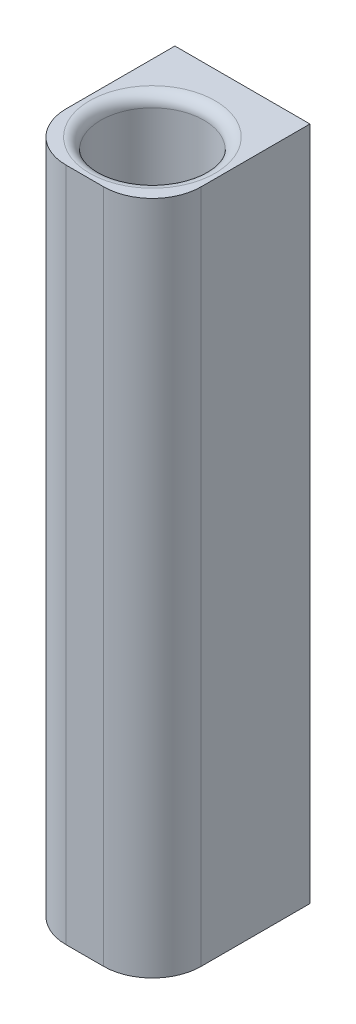
ISO-10303-21;
HEADER;
FILE_DESCRIPTION(('STEP AP214'),'2;1');
FILE_NAME('part.step','',(''),(''),'','','');
FILE_SCHEMA(('AUTOMOTIVE_DESIGN { 1 0 10303 214 1 1 1 1 }'));
ENDSEC;
DATA;
#1=APPLICATION_CONTEXT('core data for automotive mechanical design processes');
#2=APPLICATION_PROTOCOL_DEFINITION('international standard','automotive_design',2000,#1);
#3=PRODUCT_CONTEXT('',#1,'mechanical');
#4=PRODUCT('Part','Part','',(#3));
#5=PRODUCT_RELATED_PRODUCT_CATEGORY('part','',(#4));
#6=PRODUCT_DEFINITION_FORMATION('','',#4);
#7=PRODUCT_DEFINITION_CONTEXT('part definition',#1,'design');
#8=PRODUCT_DEFINITION('design','',#6,#7);
#9=PRODUCT_DEFINITION_SHAPE('','',#8);
#10=(LENGTH_UNIT() NAMED_UNIT(*) SI_UNIT(.MILLI.,.METRE.));
#11=(NAMED_UNIT(*) PLANE_ANGLE_UNIT() SI_UNIT($,.RADIAN.));
#12=(NAMED_UNIT(*) SI_UNIT($,.STERADIAN.) SOLID_ANGLE_UNIT());
#13=UNCERTAINTY_MEASURE_WITH_UNIT(LENGTH_MEASURE(1.E-05),#10,'distance_accuracy_value','');
#14=(GEOMETRIC_REPRESENTATION_CONTEXT(3) GLOBAL_UNCERTAINTY_ASSIGNED_CONTEXT((#13)) GLOBAL_UNIT_ASSIGNED_CONTEXT((#10,
#11,#12)) REPRESENTATION_CONTEXT('',''));
#15=CARTESIAN_POINT('',(0.,0.,0.));
#16=DIRECTION('',(0.,0.,1.));
#17=DIRECTION('',(1.,0.,0.));
#18=AXIS2_PLACEMENT_3D('',#15,#16,#17);
#19=CARTESIAN_POINT('',(0.,180.,0.));
#20=DIRECTION('',(0.,1.,0.));
#21=DIRECTION('',(0.,0.,1.));
#22=AXIS2_PLACEMENT_3D('',#19,#20,#21);
#23=PLANE('',#22);
#24=CARTESIAN_POINT('',(0.,180.,-5.83724052362973));
#25=DIRECTION('',(0.,1.,0.));
#26=DIRECTION('',(0.,0.,1.));
#27=AXIS2_PLACEMENT_3D('',#24,#25,#26);
#28=CIRCLE('',#27,16.75);
#29=CARTESIAN_POINT('',(0.,180.,10.9127594763703));
#30=VERTEX_POINT('',#29);
#31=EDGE_CURVE('E11',#30,#30,#28,.F.);
#32=ORIENTED_EDGE('',*,*,#31,.T.);
#33=EDGE_LOOP('',(#32));
#34=FACE_BOUND('',#33,.T.);
#35=DIRECTION('',(0.,0.,1.));
#36=VECTOR('',#35,1.);
#37=CARTESIAN_POINT('',(-18.,180.,-29.8372405236297));
#38=LINE('',#37,#36);
#39=CARTESIAN_POINT('',(-18.,180.,-29.8372405236297));
#40=VERTEX_POINT('',#39);
#41=CARTESIAN_POINT('',(-18.,180.,-0.837240523629726));
#42=VERTEX_POINT('',#41);
#43=EDGE_CURVE('E92',#40,#42,#38,.T.);
#44=ORIENTED_EDGE('',*,*,#43,.T.);
#45=CARTESIAN_POINT('',(-5.,180.,-0.837240523629726));
#46=DIRECTION('',(0.,1.,0.));
#47=DIRECTION('',(0.,0.,1.));
#48=AXIS2_PLACEMENT_3D('',#45,#46,#47);
#49=CIRCLE('',#48,13.);
#50=CARTESIAN_POINT('',(-5.,180.,12.1627594763703));
#51=VERTEX_POINT('',#50);
#52=EDGE_CURVE('E136',#42,#51,#49,.T.);
#53=ORIENTED_EDGE('',*,*,#52,.T.);
#54=DIRECTION('',(1.,0.,0.));
#55=VECTOR('',#54,1.);
#56=CARTESIAN_POINT('',(-18.,180.,12.1627594763703));
#57=LINE('',#56,#55);
#58=CARTESIAN_POINT('',(5.00000000000001,180.,12.1627594763703));
#59=VERTEX_POINT('',#58);
#60=EDGE_CURVE('E114',#51,#59,#57,.T.);
#61=ORIENTED_EDGE('',*,*,#60,.T.);
#62=CARTESIAN_POINT('',(5.00000000000001,180.,-0.837240523629726));
#63=DIRECTION('',(0.,1.,0.));
#64=DIRECTION('',(0.,0.,1.));
#65=AXIS2_PLACEMENT_3D('',#62,#63,#64);
#66=CIRCLE('',#65,13.);
#67=CARTESIAN_POINT('',(18.,180.,-0.837240523629726));
#68=VERTEX_POINT('',#67);
#69=EDGE_CURVE('E53',#59,#68,#66,.T.);
#70=ORIENTED_EDGE('',*,*,#69,.T.);
#71=DIRECTION('',(0.,0.,-1.));
#72=VECTOR('',#71,1.);
#73=CARTESIAN_POINT('',(18.,180.,12.1627594763703));
#74=LINE('',#73,#72);
#75=CARTESIAN_POINT('',(18.,180.,-29.8372405236297));
#76=VERTEX_POINT('',#75);
#77=EDGE_CURVE('E100',#68,#76,#74,.T.);
#78=ORIENTED_EDGE('',*,*,#77,.T.);
#79=DIRECTION('',(-1.,0.,0.));
#80=VECTOR('',#79,1.);
#81=CARTESIAN_POINT('',(18.,180.,-29.8372405236297));
#82=LINE('',#81,#80);
#83=EDGE_CURVE('E91',#76,#40,#82,.T.);
#84=ORIENTED_EDGE('',*,*,#83,.T.);
#85=EDGE_LOOP('',(#44,#53,#61,#70,#78,#84));
#86=FACE_BOUND('',#85,.T.);
#87=ADVANCED_FACE('F39',(#34,#86),#23,.T.);
#88=CARTESIAN_POINT('',(0.,0.,0.));
#89=DIRECTION('',(0.,1.,0.));
#90=DIRECTION('',(0.,0.,1.));
#91=AXIS2_PLACEMENT_3D('',#88,#89,#90);
#92=PLANE('',#91);
#93=CARTESIAN_POINT('',(0.,0.,-5.83724052362973));
#94=DIRECTION('',(0.,1.,0.));
#95=DIRECTION('',(0.,0.,1.));
#96=AXIS2_PLACEMENT_3D('',#93,#94,#95);
#97=CIRCLE('',#96,16.75);
#98=CARTESIAN_POINT('',(0.,0.,10.9127594763703));
#99=VERTEX_POINT('',#98);
#100=EDGE_CURVE('E143',#99,#99,#97,.T.);
#101=ORIENTED_EDGE('',*,*,#100,.T.);
#102=EDGE_LOOP('',(#101));
#103=FACE_BOUND('',#102,.T.);
#104=DIRECTION('',(1.,0.,0.));
#105=VECTOR('',#104,1.);
#106=CARTESIAN_POINT('',(-18.,0.,12.1627594763703));
#107=LINE('',#106,#105);
#108=CARTESIAN_POINT('',(-5.,0.,12.1627594763703));
#109=VERTEX_POINT('',#108);
#110=CARTESIAN_POINT('',(5.00000000000001,0.,12.1627594763703));
#111=VERTEX_POINT('',#110);
#112=EDGE_CURVE('E121',#109,#111,#107,.T.);
#113=ORIENTED_EDGE('',*,*,#112,.F.);
#114=CARTESIAN_POINT('',(-5.,0.,-0.837240523629726));
#115=DIRECTION('',(0.,1.,0.));
#116=DIRECTION('',(0.,0.,1.));
#117=AXIS2_PLACEMENT_3D('',#114,#115,#116);
#118=CIRCLE('',#117,13.);
#119=CARTESIAN_POINT('',(-18.,0.,-0.837240523629726));
#120=VERTEX_POINT('',#119);
#121=EDGE_CURVE('E134',#109,#120,#118,.F.);
#122=ORIENTED_EDGE('',*,*,#121,.T.);
#123=DIRECTION('',(0.,0.,1.));
#124=VECTOR('',#123,1.);
#125=CARTESIAN_POINT('',(-18.,0.,-29.8372405236297));
#126=LINE('',#125,#124);
#127=CARTESIAN_POINT('',(-18.,0.,-29.8372405236297));
#128=VERTEX_POINT('',#127);
#129=EDGE_CURVE('E120',#128,#120,#126,.T.);
#130=ORIENTED_EDGE('',*,*,#129,.F.);
#131=DIRECTION('',(-1.,0.,0.));
#132=VECTOR('',#131,1.);
#133=CARTESIAN_POINT('',(0.,0.,-29.8372405236297));
#134=LINE('',#133,#132);
#135=CARTESIAN_POINT('',(18.,0.,-29.8372405236297));
#136=VERTEX_POINT('',#135);
#137=EDGE_CURVE('E110',#136,#128,#134,.T.);
#138=ORIENTED_EDGE('',*,*,#137,.F.);
#139=DIRECTION('',(0.,0.,-1.));
#140=VECTOR('',#139,1.);
#141=CARTESIAN_POINT('',(18.,0.,12.1627594763703));
#142=LINE('',#141,#140);
#143=CARTESIAN_POINT('',(18.,0.,-0.837240523629726));
#144=VERTEX_POINT('',#143);
#145=EDGE_CURVE('E101',#144,#136,#142,.T.);
#146=ORIENTED_EDGE('',*,*,#145,.F.);
#147=CARTESIAN_POINT('',(5.00000000000001,0.,-0.837240523629726));
#148=DIRECTION('',(0.,1.,0.));
#149=DIRECTION('',(0.,0.,1.));
#150=AXIS2_PLACEMENT_3D('',#147,#148,#149);
#151=CIRCLE('',#150,13.);
#152=EDGE_CURVE('E128',#144,#111,#151,.F.);
#153=ORIENTED_EDGE('',*,*,#152,.T.);
#154=EDGE_LOOP('',(#113,#122,#130,#138,#146,#153));
#155=FACE_BOUND('',#154,.T.);
#156=ADVANCED_FACE('F158',(#103,#155),#92,.F.);
#157=CARTESIAN_POINT('',(0.,180.,-29.8372405236297));
#158=DIRECTION('',(0.,0.,1.));
#159=DIRECTION('',(1.,0.,0.));
#160=AXIS2_PLACEMENT_3D('',#157,#158,#159);
#161=PLANE('',#160);
#162=ORIENTED_EDGE('',*,*,#137,.T.);
#163=DIRECTION('',(0.,-1.,0.));
#164=VECTOR('',#163,1.);
#165=CARTESIAN_POINT('',(-18.,180.,-29.8372405236297));
#166=LINE('',#165,#164);
#167=EDGE_CURVE('E102',#40,#128,#166,.T.);
#168=ORIENTED_EDGE('',*,*,#167,.F.);
#169=ORIENTED_EDGE('',*,*,#83,.F.);
#170=DIRECTION('',(0.,-1.,0.));
#171=VECTOR('',#170,1.);
#172=CARTESIAN_POINT('',(18.,180.,-29.8372405236297));
#173=LINE('',#172,#171);
#174=EDGE_CURVE('E109',#76,#136,#173,.T.);
#175=ORIENTED_EDGE('',*,*,#174,.T.);
#176=EDGE_LOOP('',(#162,#168,#169,#175));
#177=FACE_BOUND('',#176,.T.);
#178=ADVANCED_FACE('F104',(#177),#161,.F.);
#179=CARTESIAN_POINT('',(-18.,180.,-29.8372405236297));
#180=DIRECTION('',(1.,0.,0.));
#181=DIRECTION('',(0.,0.,-1.));
#182=AXIS2_PLACEMENT_3D('',#179,#180,#181);
#183=PLANE('',#182);
#184=ORIENTED_EDGE('',*,*,#129,.T.);
#185=DIRECTION('',(0.,-1.,0.));
#186=VECTOR('',#185,1.);
#187=CARTESIAN_POINT('',(-18.,180.,-0.837240523629726));
#188=LINE('',#187,#186);
#189=EDGE_CURVE('E64',#120,#42,#188,.F.);
#190=ORIENTED_EDGE('',*,*,#189,.T.);
#191=ORIENTED_EDGE('',*,*,#43,.F.);
#192=ORIENTED_EDGE('',*,*,#167,.T.);
#193=EDGE_LOOP('',(#184,#190,#191,#192));
#194=FACE_BOUND('',#193,.T.);
#195=ADVANCED_FACE('F115',(#194),#183,.F.);
#196=CARTESIAN_POINT('',(-18.,180.,12.1627594763703));
#197=DIRECTION('',(0.,0.,-1.));
#198=DIRECTION('',(-1.,0.,0.));
#199=AXIS2_PLACEMENT_3D('',#196,#197,#198);
#200=PLANE('',#199);
#201=ORIENTED_EDGE('',*,*,#60,.F.);
#202=DIRECTION('',(0.,-1.,0.));
#203=VECTOR('',#202,1.);
#204=CARTESIAN_POINT('',(-5.,180.,12.1627594763703));
#205=LINE('',#204,#203);
#206=EDGE_CURVE('E130',#51,#109,#205,.T.);
#207=ORIENTED_EDGE('',*,*,#206,.T.);
#208=ORIENTED_EDGE('',*,*,#112,.T.);
#209=DIRECTION('',(0.,-1.,0.));
#210=VECTOR('',#209,1.);
#211=CARTESIAN_POINT('',(5.00000000000001,180.,12.1627594763703));
#212=LINE('',#211,#210);
#213=EDGE_CURVE('E108',#111,#59,#212,.F.);
#214=ORIENTED_EDGE('',*,*,#213,.T.);
#215=EDGE_LOOP('',(#201,#207,#208,#214));
#216=FACE_BOUND('',#215,.T.);
#217=ADVANCED_FACE('F170',(#216),#200,.F.);
#218=CARTESIAN_POINT('',(18.,180.,12.1627594763703));
#219=DIRECTION('',(-1.,0.,0.));
#220=DIRECTION('',(0.,0.,1.));
#221=AXIS2_PLACEMENT_3D('',#218,#219,#220);
#222=PLANE('',#221);
#223=ORIENTED_EDGE('',*,*,#77,.F.);
#224=DIRECTION('',(0.,-1.,0.));
#225=VECTOR('',#224,1.);
#226=CARTESIAN_POINT('',(18.,180.,-0.837240523629729));
#227=LINE('',#226,#225);
#228=EDGE_CURVE('E137',#68,#144,#227,.T.);
#229=ORIENTED_EDGE('',*,*,#228,.T.);
#230=ORIENTED_EDGE('',*,*,#145,.T.);
#231=ORIENTED_EDGE('',*,*,#174,.F.);
#232=EDGE_LOOP('',(#223,#229,#230,#231));
#233=FACE_BOUND('',#232,.T.);
#234=ADVANCED_FACE('F174',(#233),#222,.F.);
#235=CARTESIAN_POINT('',(0.,180.,-5.83724052362973));
#236=DIRECTION('',(0.,-1.,0.));
#237=DIRECTION('',(0.,0.,-1.));
#238=AXIS2_PLACEMENT_3D('',#235,#236,#237);
#239=CYLINDRICAL_SURFACE('',#238,13.75);
#240=CARTESIAN_POINT('',(0.,3.,-5.83724052362973));
#241=DIRECTION('',(0.,1.,0.));
#242=DIRECTION('',(0.,0.,1.));
#243=AXIS2_PLACEMENT_3D('',#240,#241,#242);
#244=CIRCLE('',#243,13.75);
#245=CARTESIAN_POINT('',(0.,2.99999999999998,-19.5872405236297));
#246=VERTEX_POINT('',#245);
#247=EDGE_CURVE('E50',#246,#246,#244,.F.);
#248=CARTESIAN_POINT('',(0.,177.,-5.83724052362973));
#249=DIRECTION('',(0.,1.,0.));
#250=DIRECTION('',(0.,0.,1.));
#251=AXIS2_PLACEMENT_3D('',#248,#249,#250);
#252=CIRCLE('',#251,13.75);
#253=CARTESIAN_POINT('',(0.,177.,-19.5872405236297));
#254=VERTEX_POINT('',#253);
#255=EDGE_CURVE('E145',#254,#254,#252,.T.);
#256=CARTESIAN_POINT('',(0.,2.99999999999998,-19.5872405236297));
#257=CARTESIAN_POINT('',(0.,4.81249999999998,-19.5872405236297));
#258=CARTESIAN_POINT('',(0.,6.62499999999998,-19.5872405236297));
#259=CARTESIAN_POINT('',(0.,10.25,-19.5872405236297));
#260=CARTESIAN_POINT('',(0.,12.0625,-19.5872405236297));
#261=CARTESIAN_POINT('',(0.,15.6875,-19.5872405236297));
#262=CARTESIAN_POINT('',(0.,17.5,-19.5872405236297));
#263=CARTESIAN_POINT('',(0.,21.125,-19.5872405236297));
#264=CARTESIAN_POINT('',(0.,22.9375,-19.5872405236297));
#265=CARTESIAN_POINT('',(0.,26.5625,-19.5872405236297));
#266=CARTESIAN_POINT('',(0.,28.375,-19.5872405236297));
#267=CARTESIAN_POINT('',(0.,32.,-19.5872405236297));
#268=CARTESIAN_POINT('',(0.,33.8125,-19.5872405236297));
#269=CARTESIAN_POINT('',(0.,37.4375,-19.5872405236297));
#270=CARTESIAN_POINT('',(0.,39.25,-19.5872405236297));
#271=CARTESIAN_POINT('',(0.,42.875,-19.5872405236297));
#272=CARTESIAN_POINT('',(0.,44.6875,-19.5872405236297));
#273=CARTESIAN_POINT('',(0.,48.3125,-19.5872405236297));
#274=CARTESIAN_POINT('',(0.,50.125,-19.5872405236297));
#275=CARTESIAN_POINT('',(0.,53.75,-19.5872405236297));
#276=CARTESIAN_POINT('',(0.,55.5625,-19.5872405236297));
#277=CARTESIAN_POINT('',(0.,59.1875,-19.5872405236297));
#278=CARTESIAN_POINT('',(0.,61.,-19.5872405236297));
#279=CARTESIAN_POINT('',(0.,64.625,-19.5872405236297));
#280=CARTESIAN_POINT('',(0.,66.4375,-19.5872405236297));
#281=CARTESIAN_POINT('',(0.,70.0625,-19.5872405236297));
#282=CARTESIAN_POINT('',(0.,71.875,-19.5872405236297));
#283=CARTESIAN_POINT('',(0.,75.5,-19.5872405236297));
#284=CARTESIAN_POINT('',(0.,77.3125,-19.5872405236297));
#285=CARTESIAN_POINT('',(0.,80.9375,-19.5872405236297));
#286=CARTESIAN_POINT('',(0.,82.75,-19.5872405236297));
#287=CARTESIAN_POINT('',(0.,86.375,-19.5872405236297));
#288=CARTESIAN_POINT('',(0.,88.1875,-19.5872405236297));
#289=CARTESIAN_POINT('',(0.,91.8125,-19.5872405236297));
#290=CARTESIAN_POINT('',(0.,93.625,-19.5872405236297));
#291=CARTESIAN_POINT('',(0.,97.25,-19.5872405236297));
#292=CARTESIAN_POINT('',(0.,99.0625,-19.5872405236297));
#293=CARTESIAN_POINT('',(0.,102.6875,-19.5872405236297));
#294=CARTESIAN_POINT('',(0.,104.5,-19.5872405236297));
#295=CARTESIAN_POINT('',(0.,108.125,-19.5872405236297));
#296=CARTESIAN_POINT('',(0.,109.9375,-19.5872405236297));
#297=CARTESIAN_POINT('',(0.,113.5625,-19.5872405236297));
#298=CARTESIAN_POINT('',(0.,115.375,-19.5872405236297));
#299=CARTESIAN_POINT('',(0.,119.,-19.5872405236297));
#300=CARTESIAN_POINT('',(0.,120.8125,-19.5872405236297));
#301=CARTESIAN_POINT('',(0.,124.4375,-19.5872405236297));
#302=CARTESIAN_POINT('',(0.,126.25,-19.5872405236297));
#303=CARTESIAN_POINT('',(0.,129.875,-19.5872405236297));
#304=CARTESIAN_POINT('',(0.,131.6875,-19.5872405236297));
#305=CARTESIAN_POINT('',(0.,135.3125,-19.5872405236297));
#306=CARTESIAN_POINT('',(0.,137.125,-19.5872405236297));
#307=CARTESIAN_POINT('',(0.,140.75,-19.5872405236297));
#308=CARTESIAN_POINT('',(0.,142.5625,-19.5872405236297));
#309=CARTESIAN_POINT('',(0.,146.1875,-19.5872405236297));
#310=CARTESIAN_POINT('',(0.,148.,-19.5872405236297));
#311=CARTESIAN_POINT('',(0.,151.625,-19.5872405236297));
#312=CARTESIAN_POINT('',(0.,153.4375,-19.5872405236297));
#313=CARTESIAN_POINT('',(0.,157.0625,-19.5872405236297));
#314=CARTESIAN_POINT('',(0.,158.875,-19.5872405236297));
#315=CARTESIAN_POINT('',(0.,162.5,-19.5872405236297));
#316=CARTESIAN_POINT('',(0.,164.3125,-19.5872405236297));
#317=CARTESIAN_POINT('',(0.,167.9375,-19.5872405236297));
#318=CARTESIAN_POINT('',(0.,169.75,-19.5872405236297));
#319=CARTESIAN_POINT('',(0.,173.375,-19.5872405236297));
#320=CARTESIAN_POINT('',(0.,175.1875,-19.5872405236297));
#321=CARTESIAN_POINT('',(0.,177.,-19.5872405236297));
#322=B_SPLINE_CURVE_WITH_KNOTS('',3,(#256,#257,#258,#259,#260,#261,#262,#263,#264,#265,#266,
#267,#268,#269,#270,#271,#272,#273,#274,#275,#276,#277,#278,#279,#280,#281,#282,#283,#284,#285,
#286,#287,#288,#289,#290,#291,#292,#293,#294,#295,#296,#297,#298,#299,#300,#301,#302,#303,#304,
#305,#306,#307,#308,#309,#310,#311,#312,#313,#314,#315,#316,#317,#318,#319,#320,#321),
.UNSPECIFIED.,.F.,.F.,(4,2,2,2,2,2,2,2,2,2,2,2,2,2,2,2,2,2,2,2,2,2,2,2,2,2,2,2,2,2,2,2,4),(0.,
5.43750000000001,10.875,16.3125,21.75,27.1875,32.625,38.0625,43.5,48.9375,54.375,59.8125,65.25,
70.6875,76.125,81.5625,87.,92.4375,97.875,103.3125,108.75,114.1875,119.625,125.0625,130.5,
135.9375,141.375,146.8125,152.25,157.6875,163.125,168.5625,174.),.UNSPECIFIED.);
#323=EDGE_CURVE('BSEAM149',#246,#254,#322,.T.);
#324=ORIENTED_EDGE('',*,*,#247,.T.);
#325=ORIENTED_EDGE('',*,*,#255,.T.);
#326=ORIENTED_EDGE('',*,*,#323,.T.);
#327=ORIENTED_EDGE('',*,*,#323,.F.);
#328=EDGE_LOOP('',(#324,#326,#325,#327));
#329=FACE_BOUND('',#328,.T.);
#330=ADVANCED_FACE('F149',(#329),#239,.F.);
#331=CARTESIAN_POINT('',(-5.,180.,-0.837240523629726));
#332=DIRECTION('',(0.,-1.,0.));
#333=DIRECTION('',(0.,0.,-1.));
#334=AXIS2_PLACEMENT_3D('',#331,#332,#333);
#335=CYLINDRICAL_SURFACE('',#334,13.);
#336=ORIENTED_EDGE('',*,*,#52,.F.);
#337=ORIENTED_EDGE('',*,*,#189,.F.);
#338=ORIENTED_EDGE('',*,*,#121,.F.);
#339=ORIENTED_EDGE('',*,*,#206,.F.);
#340=EDGE_LOOP('',(#336,#337,#338,#339));
#341=FACE_BOUND('',#340,.T.);
#342=ADVANCED_FACE('F175',(#341),#335,.T.);
#343=CARTESIAN_POINT('',(5.00000000000001,180.,-0.837240523629726));
#344=DIRECTION('',(0.,-1.,0.));
#345=DIRECTION('',(0.,0.,-1.));
#346=AXIS2_PLACEMENT_3D('',#343,#344,#345);
#347=CYLINDRICAL_SURFACE('',#346,13.);
#348=ORIENTED_EDGE('',*,*,#69,.F.);
#349=ORIENTED_EDGE('',*,*,#213,.F.);
#350=ORIENTED_EDGE('',*,*,#152,.F.);
#351=ORIENTED_EDGE('',*,*,#228,.F.);
#352=EDGE_LOOP('',(#348,#349,#350,#351));
#353=FACE_BOUND('',#352,.T.);
#354=ADVANCED_FACE('F154',(#353),#347,.T.);
#355=CARTESIAN_POINT('',(0.,3.,-5.83724052362973));
#356=DIRECTION('',(0.,1.,0.));
#357=DIRECTION('',(0.,0.,1.));
#358=AXIS2_PLACEMENT_3D('',#355,#356,#357);
#359=TOROIDAL_SURFACE('',#358,16.75,3.);
#360=ORIENTED_EDGE('',*,*,#247,.F.);
#361=EDGE_LOOP('',(#360));
#362=FACE_BOUND('',#361,.T.);
#363=ORIENTED_EDGE('',*,*,#100,.F.);
#364=EDGE_LOOP('',(#363));
#365=FACE_BOUND('',#364,.T.);
#366=ADVANCED_FACE('F155',(#362,#365),#359,.T.);
#367=CARTESIAN_POINT('',(0.,177.,-5.83724052362973));
#368=DIRECTION('',(0.,1.,0.));
#369=DIRECTION('',(0.,0.,1.));
#370=AXIS2_PLACEMENT_3D('',#367,#368,#369);
#371=TOROIDAL_SURFACE('',#370,16.75,3.);
#372=ORIENTED_EDGE('',*,*,#31,.F.);
#373=EDGE_LOOP('',(#372));
#374=FACE_BOUND('',#373,.T.);
#375=ORIENTED_EDGE('',*,*,#255,.F.);
#376=EDGE_LOOP('',(#375));
#377=FACE_BOUND('',#376,.T.);
#378=ADVANCED_FACE('F41',(#374,#377),#371,.T.);
#379=CLOSED_SHELL('',(#87,#156,#178,#195,#217,#234,#330,#342,#354,#366,#378));
#380=MANIFOLD_SOLID_BREP('B2',#379);
#381=ADVANCED_BREP_SHAPE_REPRESENTATION('',(#18,#380),#14);
#382=SHAPE_DEFINITION_REPRESENTATION(#9,#381);
ENDSEC;
END-ISO-10303-21;
